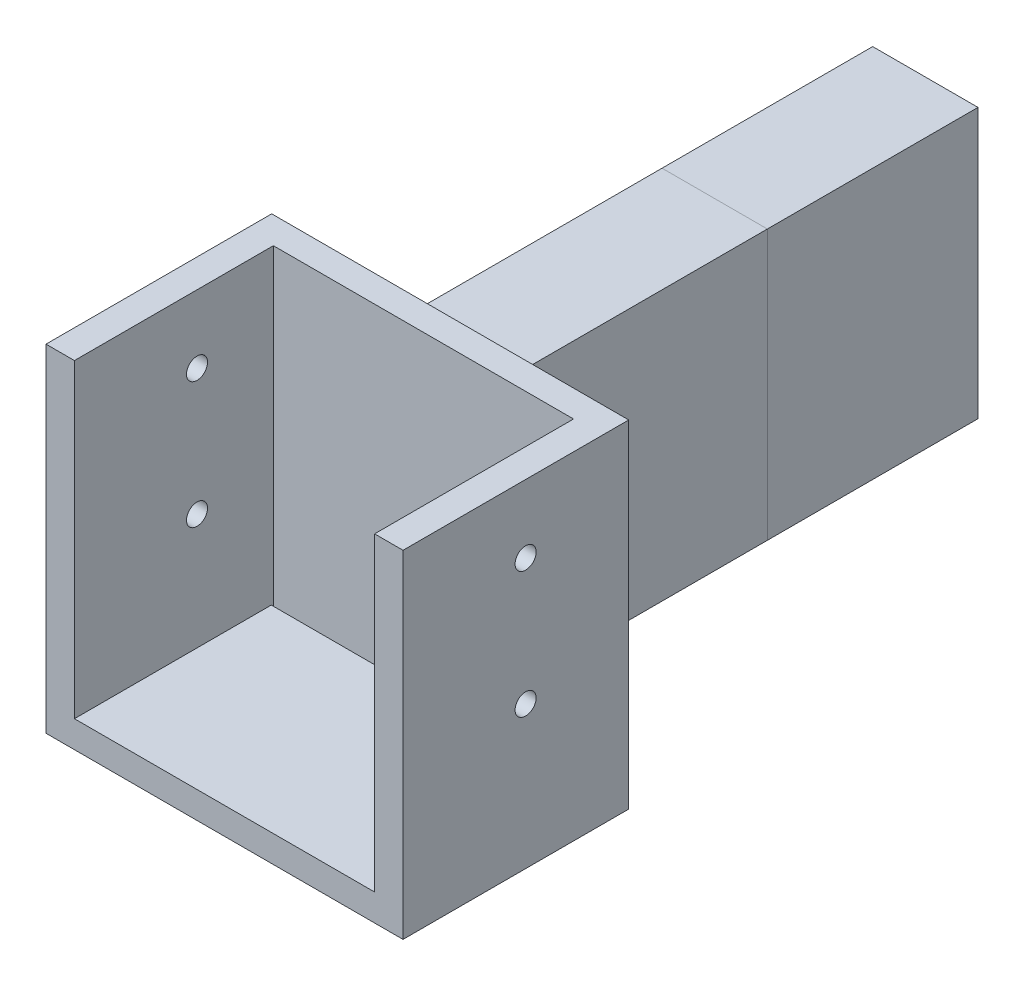
ISO-10303-21;
HEADER;
FILE_DESCRIPTION(('STEP AP214'),'2;1');
FILE_NAME('part.step','',(''),(''),'','','');
FILE_SCHEMA(('AUTOMOTIVE_DESIGN { 1 0 10303 214 1 1 1 1 }'));
ENDSEC;
DATA;
#1=APPLICATION_CONTEXT('core data for automotive mechanical design processes');
#2=APPLICATION_PROTOCOL_DEFINITION('international standard','automotive_design',2000,#1);
#3=PRODUCT_CONTEXT('',#1,'mechanical');
#4=PRODUCT('Part','Part','',(#3));
#5=PRODUCT_RELATED_PRODUCT_CATEGORY('part','',(#4));
#6=PRODUCT_DEFINITION_FORMATION('','',#4);
#7=PRODUCT_DEFINITION_CONTEXT('part definition',#1,'design');
#8=PRODUCT_DEFINITION('design','',#6,#7);
#9=PRODUCT_DEFINITION_SHAPE('','',#8);
#10=(LENGTH_UNIT() NAMED_UNIT(*) SI_UNIT(.MILLI.,.METRE.));
#11=(NAMED_UNIT(*) PLANE_ANGLE_UNIT() SI_UNIT($,.RADIAN.));
#12=(NAMED_UNIT(*) SI_UNIT($,.STERADIAN.) SOLID_ANGLE_UNIT());
#13=UNCERTAINTY_MEASURE_WITH_UNIT(LENGTH_MEASURE(1.E-05),#10,'distance_accuracy_value','');
#14=(GEOMETRIC_REPRESENTATION_CONTEXT(3) GLOBAL_UNCERTAINTY_ASSIGNED_CONTEXT((#13)) GLOBAL_UNIT_ASSIGNED_CONTEXT((#10,
#11,#12)) REPRESENTATION_CONTEXT('',''));
#15=CARTESIAN_POINT('',(0.,0.,0.));
#16=DIRECTION('',(0.,0.,1.));
#17=DIRECTION('',(1.,0.,0.));
#18=AXIS2_PLACEMENT_3D('',#15,#16,#17);
#19=CARTESIAN_POINT('',(-5.,28.6743328702386,-37.8156931180885));
#20=DIRECTION('',(0.,0.,-1.));
#21=DIRECTION('',(-1.,0.,0.));
#22=AXIS2_PLACEMENT_3D('',#19,#20,#21);
#23=PLANE('',#22);
#24=DIRECTION('',(1.,0.,0.));
#25=VECTOR('',#24,1.);
#26=CARTESIAN_POINT('',(-5.,3.07250683078621,-37.8156931180885));
#27=LINE('',#26,#25);
#28=CARTESIAN_POINT('',(-5.,3.07250683078621,-37.8156931180885));
#29=VERTEX_POINT('',#28);
#30=CARTESIAN_POINT('',(5.,3.07250683078621,-37.8156931180885));
#31=VERTEX_POINT('',#30);
#32=EDGE_CURVE('P0_E114',#29,#31,#27,.T.);
#33=ORIENTED_EDGE('',*,*,#32,.F.);
#34=DIRECTION('',(0.,1.,0.));
#35=VECTOR('',#34,1.);
#36=CARTESIAN_POINT('',(-5.,0.,-37.8156931180885));
#37=LINE('',#36,#35);
#38=CARTESIAN_POINT('',(-5.,28.6743328702386,-37.8156931180885));
#39=VERTEX_POINT('',#38);
#40=EDGE_CURVE('P0_E131',#39,#29,#37,.F.);
#41=ORIENTED_EDGE('',*,*,#40,.F.);
#42=DIRECTION('',(1.,0.,0.));
#43=VECTOR('',#42,1.);
#44=CARTESIAN_POINT('',(-5.,28.6743328702386,-37.8156931180885));
#45=LINE('',#44,#43);
#46=CARTESIAN_POINT('',(5.,28.6743328702386,-37.8156931180885));
#47=VERTEX_POINT('',#46);
#48=EDGE_CURVE('P0_E128',#47,#39,#45,.F.);
#49=ORIENTED_EDGE('',*,*,#48,.F.);
#50=DIRECTION('',(0.,1.,0.));
#51=VECTOR('',#50,1.);
#52=CARTESIAN_POINT('',(5.,0.,-37.8156931180885));
#53=LINE('',#52,#51);
#54=EDGE_CURVE('P0_E119',#47,#31,#53,.F.);
#55=ORIENTED_EDGE('',*,*,#54,.T.);
#56=EDGE_LOOP('',(#33,#41,#49,#55));
#57=FACE_BOUND('',#56,.T.);
#58=ADVANCED_FACE('P0_F17',(#57),#23,.T.);
#59=CARTESIAN_POINT('',(-5.,28.6743328702386,-12.2063953488372));
#60=DIRECTION('',(0.,1.,0.));
#61=DIRECTION('',(0.,0.,1.));
#62=AXIS2_PLACEMENT_3D('',#59,#60,#61);
#63=PLANE('',#62);
#64=ORIENTED_EDGE('',*,*,#48,.T.);
#65=DIRECTION('',(0.,0.,1.));
#66=VECTOR('',#65,1.);
#67=CARTESIAN_POINT('',(-5.,28.6743328702386,0.));
#68=LINE('',#67,#66);
#69=CARTESIAN_POINT('',(-5.,28.6743328702386,-12.2063953488372));
#70=VERTEX_POINT('',#69);
#71=EDGE_CURVE('P0_E190',#70,#39,#68,.F.);
#72=ORIENTED_EDGE('',*,*,#71,.F.);
#73=DIRECTION('',(1.,0.,0.));
#74=VECTOR('',#73,1.);
#75=CARTESIAN_POINT('',(-16.4529069767442,28.6743328702386,-12.2063953488372));
#76=LINE('',#75,#74);
#77=CARTESIAN_POINT('',(5.,28.6743328702386,-12.2063953488372));
#78=VERTEX_POINT('',#77);
#79=EDGE_CURVE('P0_E138',#70,#78,#76,.T.);
#80=ORIENTED_EDGE('',*,*,#79,.T.);
#81=DIRECTION('',(0.,0.,1.));
#82=VECTOR('',#81,1.);
#83=CARTESIAN_POINT('',(5.,28.6743328702386,0.));
#84=LINE('',#83,#82);
#85=EDGE_CURVE('P0_E124',#78,#47,#84,.F.);
#86=ORIENTED_EDGE('',*,*,#85,.T.);
#87=EDGE_LOOP('',(#64,#72,#80,#86));
#88=FACE_BOUND('',#87,.T.);
#89=ADVANCED_FACE('P0_F137',(#88),#63,.T.);
#90=CARTESIAN_POINT('',(5.,0.,0.));
#91=DIRECTION('',(-1.,0.,0.));
#92=DIRECTION('',(0.,0.,1.));
#93=AXIS2_PLACEMENT_3D('',#90,#91,#92);
#94=PLANE('',#93);
#95=DIRECTION('',(0.,1.,0.));
#96=VECTOR('',#95,1.);
#97=CARTESIAN_POINT('',(5.,32.,-12.2063953488372));
#98=LINE('',#97,#96);
#99=CARTESIAN_POINT('',(5.,3.07250683078621,-12.2063953488372));
#100=VERTEX_POINT('',#99);
#101=EDGE_CURVE('P0_E198',#78,#100,#98,.F.);
#102=ORIENTED_EDGE('',*,*,#101,.T.);
#103=DIRECTION('',(0.,0.,-1.));
#104=VECTOR('',#103,1.);
#105=CARTESIAN_POINT('',(5.,3.07250683078621,-12.2063953488372));
#106=LINE('',#105,#104);
#107=EDGE_CURVE('P0_E126',#31,#100,#106,.F.);
#108=ORIENTED_EDGE('',*,*,#107,.F.);
#109=ORIENTED_EDGE('',*,*,#54,.F.);
#110=ORIENTED_EDGE('',*,*,#85,.F.);
#111=EDGE_LOOP('',(#102,#108,#109,#110));
#112=FACE_BOUND('',#111,.T.);
#113=ADVANCED_FACE('P0_F122',(#112),#94,.F.);
#114=CARTESIAN_POINT('',(-5.,3.07250683078621,-12.2063953488372));
#115=DIRECTION('',(0.,-1.,0.));
#116=DIRECTION('',(0.,0.,-1.));
#117=AXIS2_PLACEMENT_3D('',#114,#115,#116);
#118=PLANE('',#117);
#119=DIRECTION('',(1.,0.,0.));
#120=VECTOR('',#119,1.);
#121=CARTESIAN_POINT('',(-16.4529069767442,3.07250683078621,-12.2063953488372));
#122=LINE('',#121,#120);
#123=CARTESIAN_POINT('',(-5.,3.07250683078621,-12.2063953488372));
#124=VERTEX_POINT('',#123);
#125=EDGE_CURVE('P0_E194',#100,#124,#122,.F.);
#126=ORIENTED_EDGE('',*,*,#125,.T.);
#127=DIRECTION('',(0.,0.,1.));
#128=VECTOR('',#127,1.);
#129=CARTESIAN_POINT('',(-5.,3.07250683078621,0.));
#130=LINE('',#129,#128);
#131=EDGE_CURVE('P0_E184',#29,#124,#130,.T.);
#132=ORIENTED_EDGE('',*,*,#131,.F.);
#133=ORIENTED_EDGE('',*,*,#32,.T.);
#134=ORIENTED_EDGE('',*,*,#107,.T.);
#135=EDGE_LOOP('',(#126,#132,#133,#134));
#136=FACE_BOUND('',#135,.T.);
#137=ADVANCED_FACE('P0_F193',(#136),#118,.T.);
#138=CARTESIAN_POINT('',(-5.,0.,0.));
#139=DIRECTION('',(-1.,0.,0.));
#140=DIRECTION('',(0.,0.,1.));
#141=AXIS2_PLACEMENT_3D('',#138,#139,#140);
#142=PLANE('',#141);
#143=ORIENTED_EDGE('',*,*,#131,.T.);
#144=DIRECTION('',(0.,1.,0.));
#145=VECTOR('',#144,1.);
#146=CARTESIAN_POINT('',(-5.,32.,-12.2063953488372));
#147=LINE('',#146,#145);
#148=EDGE_CURVE('P0_E200',#124,#70,#147,.T.);
#149=ORIENTED_EDGE('',*,*,#148,.T.);
#150=ORIENTED_EDGE('',*,*,#71,.T.);
#151=ORIENTED_EDGE('',*,*,#40,.T.);
#152=EDGE_LOOP('',(#143,#149,#150,#151));
#153=FACE_BOUND('',#152,.T.);
#154=ADVANCED_FACE('P0_F337',(#153),#142,.T.);
#155=CARTESIAN_POINT('',(17.4470930232558,25.5486727570291,-2.41569767441797));
#156=DIRECTION('',(-1.,0.,0.));
#157=DIRECTION('',(0.,0.,1.));
#158=AXIS2_PLACEMENT_3D('',#155,#156,#157);
#159=CYLINDRICAL_SURFACE('',#158,1.00000000000003);
#160=CARTESIAN_POINT('',(-13.7529069767442,25.5486727570291,-2.41569767441797));
#161=DIRECTION('',(-1.,0.,0.));
#162=DIRECTION('',(0.,0.,1.));
#163=AXIS2_PLACEMENT_3D('',#160,#161,#162);
#164=CIRCLE('',#163,1.00000000000003);
#165=CARTESIAN_POINT('',(-13.7529069767442,25.5486727570291,-1.41569767441794));
#166=VERTEX_POINT('',#165);
#167=EDGE_CURVE('P0_E155',#166,#166,#164,.F.);
#168=ORIENTED_EDGE('',*,*,#167,.T.);
#169=EDGE_LOOP('',(#168));
#170=FACE_BOUND('',#169,.T.);
#171=CARTESIAN_POINT('',(-16.4529069767442,25.5486727570291,-2.41569767441797));
#172=DIRECTION('',(-1.,0.,0.));
#173=DIRECTION('',(0.,0.,1.));
#174=AXIS2_PLACEMENT_3D('',#171,#172,#173);
#175=CIRCLE('',#174,1.00000000000003);
#176=CARTESIAN_POINT('',(-16.4529069767442,25.5486727570291,-1.41569767441794));
#177=VERTEX_POINT('',#176);
#178=EDGE_CURVE('P0_E20',#177,#177,#175,.T.);
#179=ORIENTED_EDGE('',*,*,#178,.T.);
#180=EDGE_LOOP('',(#179));
#181=FACE_BOUND('',#180,.T.);
#182=ADVANCED_FACE('P0_F333',(#170,#181),#159,.F.);
#183=CARTESIAN_POINT('',(17.4470930232558,13.5486727570291,-2.41569767441797));
#184=DIRECTION('',(-1.,0.,0.));
#185=DIRECTION('',(0.,0.,1.));
#186=AXIS2_PLACEMENT_3D('',#183,#184,#185);
#187=CYLINDRICAL_SURFACE('',#186,1.00000000000003);
#188=CARTESIAN_POINT('',(-13.7529069767442,13.5486727570291,-2.41569767441797));
#189=DIRECTION('',(-1.,0.,0.));
#190=DIRECTION('',(0.,0.,1.));
#191=AXIS2_PLACEMENT_3D('',#188,#189,#190);
#192=CIRCLE('',#191,1.00000000000003);
#193=CARTESIAN_POINT('',(-13.7529069767442,13.5486727570291,-1.41569767441794));
#194=VERTEX_POINT('',#193);
#195=EDGE_CURVE('P0_E151',#194,#194,#192,.F.);
#196=ORIENTED_EDGE('',*,*,#195,.T.);
#197=EDGE_LOOP('',(#196));
#198=FACE_BOUND('',#197,.T.);
#199=CARTESIAN_POINT('',(-16.4529069767442,13.5486727570291,-2.41569767441797));
#200=DIRECTION('',(-1.,0.,0.));
#201=DIRECTION('',(0.,0.,1.));
#202=AXIS2_PLACEMENT_3D('',#199,#200,#201);
#203=CIRCLE('',#202,1.00000000000003);
#204=CARTESIAN_POINT('',(-16.4529069767442,13.5486727570291,-1.41569767441794));
#205=VERTEX_POINT('',#204);
#206=EDGE_CURVE('P0_E166',#205,#205,#203,.T.);
#207=ORIENTED_EDGE('',*,*,#206,.T.);
#208=EDGE_LOOP('',(#207));
#209=FACE_BOUND('',#208,.T.);
#210=ADVANCED_FACE('P0_F329',(#198,#209),#187,.F.);
#211=CARTESIAN_POINT('',(17.4470930232558,25.5486727570291,-2.41569767441797));
#212=DIRECTION('',(-1.,0.,0.));
#213=DIRECTION('',(0.,0.,1.));
#214=AXIS2_PLACEMENT_3D('',#211,#212,#213);
#215=CYLINDRICAL_SURFACE('',#214,1.00000000000003);
#216=CARTESIAN_POINT('',(14.7470930232558,25.5486727570291,-2.41569767441797));
#217=DIRECTION('',(-1.,0.,0.));
#218=DIRECTION('',(0.,0.,1.));
#219=AXIS2_PLACEMENT_3D('',#216,#217,#218);
#220=CIRCLE('',#219,1.00000000000003);
#221=CARTESIAN_POINT('',(14.7470930232558,25.5486727570291,-1.41569767441794));
#222=VERTEX_POINT('',#221);
#223=EDGE_CURVE('P0_E147',#222,#222,#220,.T.);
#224=ORIENTED_EDGE('',*,*,#223,.T.);
#225=EDGE_LOOP('',(#224));
#226=FACE_BOUND('',#225,.T.);
#227=CARTESIAN_POINT('',(17.4470930232558,25.5486727570291,-2.41569767441797));
#228=DIRECTION('',(-1.,0.,0.));
#229=DIRECTION('',(0.,0.,1.));
#230=AXIS2_PLACEMENT_3D('',#227,#228,#229);
#231=CIRCLE('',#230,1.00000000000003);
#232=CARTESIAN_POINT('',(17.4470930232558,25.5486727570291,-1.41569767441794));
#233=VERTEX_POINT('',#232);
#234=EDGE_CURVE('P0_E163',#233,#233,#231,.F.);
#235=ORIENTED_EDGE('',*,*,#234,.T.);
#236=EDGE_LOOP('',(#235));
#237=FACE_BOUND('',#236,.T.);
#238=ADVANCED_FACE('P0_F325',(#226,#237),#215,.F.);
#239=CARTESIAN_POINT('',(17.4470930232558,13.5486727570291,-2.41569767441797));
#240=DIRECTION('',(-1.,0.,0.));
#241=DIRECTION('',(0.,0.,1.));
#242=AXIS2_PLACEMENT_3D('',#239,#240,#241);
#243=CYLINDRICAL_SURFACE('',#242,1.00000000000003);
#244=CARTESIAN_POINT('',(14.7470930232558,13.5486727570291,-2.41569767441797));
#245=DIRECTION('',(-1.,0.,0.));
#246=DIRECTION('',(0.,0.,1.));
#247=AXIS2_PLACEMENT_3D('',#244,#245,#246);
#248=CIRCLE('',#247,1.00000000000003);
#249=CARTESIAN_POINT('',(14.7470930232558,13.5486727570291,-1.41569767441794));
#250=VERTEX_POINT('',#249);
#251=EDGE_CURVE('P0_E143',#250,#250,#248,.T.);
#252=ORIENTED_EDGE('',*,*,#251,.T.);
#253=EDGE_LOOP('',(#252));
#254=FACE_BOUND('',#253,.T.);
#255=CARTESIAN_POINT('',(17.4470930232558,13.5486727570291,-2.41569767441797));
#256=DIRECTION('',(-1.,0.,0.));
#257=DIRECTION('',(0.,0.,1.));
#258=AXIS2_PLACEMENT_3D('',#255,#256,#257);
#259=CIRCLE('',#258,1.00000000000003);
#260=CARTESIAN_POINT('',(17.4470930232558,13.5486727570291,-1.41569767441794));
#261=VERTEX_POINT('',#260);
#262=EDGE_CURVE('P0_E159',#261,#261,#259,.F.);
#263=ORIENTED_EDGE('',*,*,#262,.T.);
#264=EDGE_LOOP('',(#263));
#265=FACE_BOUND('',#264,.T.);
#266=ADVANCED_FACE('P0_F322',(#254,#265),#243,.F.);
#267=CARTESIAN_POINT('',(33.6105596230915,2.54867275702964,9.22383720930233));
#268=DIRECTION('',(0.,-1.,0.));
#269=DIRECTION('',(0.,0.,-1.));
#270=AXIS2_PLACEMENT_3D('',#267,#268,#269);
#271=PLANE('',#270);
#272=DIRECTION('',(1.,0.,0.));
#273=VECTOR('',#272,1.);
#274=CARTESIAN_POINT('',(33.6105596230915,2.54867275702964,-9.46665875363806));
#275=LINE('',#274,#273);
#276=CARTESIAN_POINT('',(14.7470930232558,2.54867275702964,-9.46665875363806));
#277=VERTEX_POINT('',#276);
#278=CARTESIAN_POINT('',(-13.7529069767442,2.54867275702964,-9.46665875363806));
#279=VERTEX_POINT('',#278);
#280=EDGE_CURVE('P0_E177',#277,#279,#275,.F.);
#281=ORIENTED_EDGE('',*,*,#280,.T.);
#282=DIRECTION('',(0.,0.,1.));
#283=VECTOR('',#282,1.);
#284=CARTESIAN_POINT('',(-13.7529069767442,2.54867275702964,-9.6656976744186));
#285=LINE('',#284,#283);
#286=CARTESIAN_POINT('',(-13.7529069767442,2.54867275702964,9.22383720930233));
#287=VERTEX_POINT('',#286);
#288=EDGE_CURVE('P0_E154',#279,#287,#285,.T.);
#289=ORIENTED_EDGE('',*,*,#288,.T.);
#290=DIRECTION('',(-1.,0.,0.));
#291=VECTOR('',#290,1.);
#292=CARTESIAN_POINT('',(14.7470930232558,2.54867275702964,9.22383720930233));
#293=LINE('',#292,#291);
#294=CARTESIAN_POINT('',(14.7470930232558,2.54867275702964,9.22383720930233));
#295=VERTEX_POINT('',#294);
#296=EDGE_CURVE('P0_E174',#287,#295,#293,.F.);
#297=ORIENTED_EDGE('',*,*,#296,.T.);
#298=DIRECTION('',(0.,0.,-1.));
#299=VECTOR('',#298,1.);
#300=CARTESIAN_POINT('',(14.7470930232558,2.54867275702964,-9.6656976744186));
#301=LINE('',#300,#299);
#302=EDGE_CURVE('P0_E237',#295,#277,#301,.T.);
#303=ORIENTED_EDGE('',*,*,#302,.T.);
#304=EDGE_LOOP('',(#281,#289,#297,#303));
#305=FACE_BOUND('',#304,.T.);
#306=ADVANCED_FACE('P0_F318',(#305),#271,.F.);
#307=CARTESIAN_POINT('',(33.6105596230915,0.,-9.46665875363806));
#308=DIRECTION('',(0.,0.,1.));
#309=DIRECTION('',(1.,0.,0.));
#310=AXIS2_PLACEMENT_3D('',#307,#308,#309);
#311=PLANE('',#310);
#312=DIRECTION('',(1.,0.,0.));
#313=VECTOR('',#312,1.);
#314=CARTESIAN_POINT('',(0.,0.,-9.46665875363806));
#315=LINE('',#314,#313);
#316=CARTESIAN_POINT('',(-13.7529069767442,0.,-9.46665875363806));
#317=VERTEX_POINT('',#316);
#318=CARTESIAN_POINT('',(14.7470930232558,0.,-9.46665875363806));
#319=VERTEX_POINT('',#318);
#320=EDGE_CURVE('P0_E245',#317,#319,#315,.T.);
#321=ORIENTED_EDGE('',*,*,#320,.F.);
#322=DIRECTION('',(0.,1.,0.));
#323=VECTOR('',#322,1.);
#324=CARTESIAN_POINT('',(-13.7529069767442,32.,-9.46665875363806));
#325=LINE('',#324,#323);
#326=EDGE_CURVE('P0_E213',#317,#279,#325,.T.);
#327=ORIENTED_EDGE('',*,*,#326,.T.);
#328=ORIENTED_EDGE('',*,*,#280,.F.);
#329=DIRECTION('',(0.,1.,0.));
#330=VECTOR('',#329,1.);
#331=CARTESIAN_POINT('',(14.7470930232558,32.,-9.46665875363806));
#332=LINE('',#331,#330);
#333=EDGE_CURVE('P0_E239',#277,#319,#332,.F.);
#334=ORIENTED_EDGE('',*,*,#333,.T.);
#335=EDGE_LOOP('',(#321,#327,#328,#334));
#336=FACE_BOUND('',#335,.T.);
#337=ADVANCED_FACE('P0_F314',(#336),#311,.F.);
#338=CARTESIAN_POINT('',(14.7470930232558,32.,9.22383720930233));
#339=DIRECTION('',(0.,0.,-1.));
#340=DIRECTION('',(-1.,0.,0.));
#341=AXIS2_PLACEMENT_3D('',#338,#339,#340);
#342=PLANE('',#341);
#343=DIRECTION('',(0.,1.,0.));
#344=VECTOR('',#343,1.);
#345=CARTESIAN_POINT('',(17.4470930232558,32.,9.22383720930233));
#346=LINE('',#345,#344);
#347=CARTESIAN_POINT('',(17.4470930232558,0.,9.22383720930233));
#348=VERTEX_POINT('',#347);
#349=CARTESIAN_POINT('',(17.4470930232558,32.,9.22383720930233));
#350=VERTEX_POINT('',#349);
#351=EDGE_CURVE('P0_E162',#348,#350,#346,.T.);
#352=ORIENTED_EDGE('',*,*,#351,.T.);
#353=DIRECTION('',(1.,0.,0.));
#354=VECTOR('',#353,1.);
#355=CARTESIAN_POINT('',(0.,32.,9.22383720930233));
#356=LINE('',#355,#354);
#357=CARTESIAN_POINT('',(14.7470930232558,32.,9.22383720930233));
#358=VERTEX_POINT('',#357);
#359=EDGE_CURVE('P0_E225',#350,#358,#356,.F.);
#360=ORIENTED_EDGE('',*,*,#359,.T.);
#361=DIRECTION('',(0.,1.,0.));
#362=VECTOR('',#361,1.);
#363=CARTESIAN_POINT('',(14.7470930232558,32.,9.22383720930233));
#364=LINE('',#363,#362);
#365=EDGE_CURVE('P0_E234',#358,#295,#364,.F.);
#366=ORIENTED_EDGE('',*,*,#365,.T.);
#367=ORIENTED_EDGE('',*,*,#296,.F.);
#368=DIRECTION('',(0.,1.,0.));
#369=VECTOR('',#368,1.);
#370=CARTESIAN_POINT('',(-13.7529069767442,32.,9.22383720930233));
#371=LINE('',#370,#369);
#372=CARTESIAN_POINT('',(-13.7529069767442,32.,9.22383720930233));
#373=VERTEX_POINT('',#372);
#374=EDGE_CURVE('P0_E211',#287,#373,#371,.T.);
#375=ORIENTED_EDGE('',*,*,#374,.T.);
#376=DIRECTION('',(1.,0.,0.));
#377=VECTOR('',#376,1.);
#378=CARTESIAN_POINT('',(0.,32.,9.22383720930233));
#379=LINE('',#378,#377);
#380=CARTESIAN_POINT('',(-16.4529069767442,32.,9.22383720930233));
#381=VERTEX_POINT('',#380);
#382=EDGE_CURVE('P0_E150',#373,#381,#379,.F.);
#383=ORIENTED_EDGE('',*,*,#382,.T.);
#384=DIRECTION('',(0.,1.,0.));
#385=VECTOR('',#384,1.);
#386=CARTESIAN_POINT('',(-16.4529069767442,32.,9.22383720930233));
#387=LINE('',#386,#385);
#388=CARTESIAN_POINT('',(-16.4529069767442,0.,9.22383720930233));
#389=VERTEX_POINT('',#388);
#390=EDGE_CURVE('P0_E168',#381,#389,#387,.F.);
#391=ORIENTED_EDGE('',*,*,#390,.T.);
#392=DIRECTION('',(1.,0.,0.));
#393=VECTOR('',#392,1.);
#394=CARTESIAN_POINT('',(0.,0.,9.22383720930233));
#395=LINE('',#394,#393);
#396=EDGE_CURVE('P0_E248',#348,#389,#395,.F.);
#397=ORIENTED_EDGE('',*,*,#396,.F.);
#398=EDGE_LOOP('',(#352,#360,#366,#367,#375,#383,#391,#397));
#399=FACE_BOUND('',#398,.T.);
#400=ADVANCED_FACE('P0_F310',(#399),#342,.F.);
#401=CARTESIAN_POINT('',(-16.4529069767442,32.,-12.2063953488372));
#402=DIRECTION('',(1.,0.,0.));
#403=DIRECTION('',(0.,0.,-1.));
#404=AXIS2_PLACEMENT_3D('',#401,#402,#403);
#405=PLANE('',#404);
#406=ORIENTED_EDGE('',*,*,#390,.F.);
#407=DIRECTION('',(0.,0.,-1.));
#408=VECTOR('',#407,1.);
#409=CARTESIAN_POINT('',(-16.4529069767442,32.,0.));
#410=LINE('',#409,#408);
#411=CARTESIAN_POINT('',(-16.4529069767442,32.,-12.2063953488372));
#412=VERTEX_POINT('',#411);
#413=EDGE_CURVE('P0_E216',#381,#412,#410,.T.);
#414=ORIENTED_EDGE('',*,*,#413,.T.);
#415=DIRECTION('',(0.,1.,0.));
#416=VECTOR('',#415,1.);
#417=CARTESIAN_POINT('',(-16.4529069767442,32.,-12.2063953488372));
#418=LINE('',#417,#416);
#419=CARTESIAN_POINT('',(-16.4529069767442,0.,-12.2063953488372));
#420=VERTEX_POINT('',#419);
#421=EDGE_CURVE('P0_E165',#412,#420,#418,.F.);
#422=ORIENTED_EDGE('',*,*,#421,.T.);
#423=DIRECTION('',(0.,0.,-1.));
#424=VECTOR('',#423,1.);
#425=CARTESIAN_POINT('',(-16.4529069767442,0.,0.));
#426=LINE('',#425,#424);
#427=EDGE_CURVE('P0_E250',#389,#420,#426,.T.);
#428=ORIENTED_EDGE('',*,*,#427,.F.);
#429=EDGE_LOOP('',(#406,#414,#422,#428));
#430=FACE_BOUND('',#429,.T.);
#431=ORIENTED_EDGE('',*,*,#206,.F.);
#432=EDGE_LOOP('',(#431));
#433=FACE_BOUND('',#432,.T.);
#434=ORIENTED_EDGE('',*,*,#178,.F.);
#435=EDGE_LOOP('',(#434));
#436=FACE_BOUND('',#435,.T.);
#437=ADVANCED_FACE('P0_F306',(#430,#433,#436),#405,.F.);
#438=CARTESIAN_POINT('',(-16.4529069767442,32.,-12.2063953488372));
#439=DIRECTION('',(0.,0.,1.));
#440=DIRECTION('',(1.,0.,0.));
#441=AXIS2_PLACEMENT_3D('',#438,#439,#440);
#442=PLANE('',#441);
#443=ORIENTED_EDGE('',*,*,#421,.F.);
#444=DIRECTION('',(1.,0.,0.));
#445=VECTOR('',#444,1.);
#446=CARTESIAN_POINT('',(0.,32.,-12.2063953488372));
#447=LINE('',#446,#445);
#448=CARTESIAN_POINT('',(17.4470930232558,32.,-12.2063953488372));
#449=VERTEX_POINT('',#448);
#450=EDGE_CURVE('P0_E219',#412,#449,#447,.T.);
#451=ORIENTED_EDGE('',*,*,#450,.T.);
#452=DIRECTION('',(0.,1.,0.));
#453=VECTOR('',#452,1.);
#454=CARTESIAN_POINT('',(17.4470930232558,32.,-12.2063953488372));
#455=LINE('',#454,#453);
#456=CARTESIAN_POINT('',(17.4470930232558,0.,-12.2063953488372));
#457=VERTEX_POINT('',#456);
#458=EDGE_CURVE('P0_E158',#449,#457,#455,.F.);
#459=ORIENTED_EDGE('',*,*,#458,.T.);
#460=DIRECTION('',(1.,0.,0.));
#461=VECTOR('',#460,1.);
#462=CARTESIAN_POINT('',(0.,0.,-12.2063953488372));
#463=LINE('',#462,#461);
#464=EDGE_CURVE('P0_E252',#420,#457,#463,.T.);
#465=ORIENTED_EDGE('',*,*,#464,.F.);
#466=EDGE_LOOP('',(#443,#451,#459,#465));
#467=FACE_BOUND('',#466,.T.);
#468=ORIENTED_EDGE('',*,*,#125,.F.);
#469=ORIENTED_EDGE('',*,*,#101,.F.);
#470=ORIENTED_EDGE('',*,*,#79,.F.);
#471=ORIENTED_EDGE('',*,*,#148,.F.);
#472=EDGE_LOOP('',(#468,#469,#470,#471));
#473=FACE_BOUND('',#472,.T.);
#474=ADVANCED_FACE('P0_F197',(#467,#473),#442,.F.);
#475=CARTESIAN_POINT('',(17.4470930232558,32.,-12.2063953488372));
#476=DIRECTION('',(-1.,0.,0.));
#477=DIRECTION('',(0.,0.,1.));
#478=AXIS2_PLACEMENT_3D('',#475,#476,#477);
#479=PLANE('',#478);
#480=ORIENTED_EDGE('',*,*,#458,.F.);
#481=DIRECTION('',(0.,0.,-1.));
#482=VECTOR('',#481,1.);
#483=CARTESIAN_POINT('',(17.4470930232558,32.,0.));
#484=LINE('',#483,#482);
#485=EDGE_CURVE('P0_E222',#449,#350,#484,.F.);
#486=ORIENTED_EDGE('',*,*,#485,.T.);
#487=ORIENTED_EDGE('',*,*,#351,.F.);
#488=DIRECTION('',(0.,0.,-1.));
#489=VECTOR('',#488,1.);
#490=CARTESIAN_POINT('',(17.4470930232558,0.,0.));
#491=LINE('',#490,#489);
#492=EDGE_CURVE('P0_E254',#457,#348,#491,.F.);
#493=ORIENTED_EDGE('',*,*,#492,.F.);
#494=EDGE_LOOP('',(#480,#486,#487,#493));
#495=FACE_BOUND('',#494,.T.);
#496=ORIENTED_EDGE('',*,*,#262,.F.);
#497=EDGE_LOOP('',(#496));
#498=FACE_BOUND('',#497,.T.);
#499=ORIENTED_EDGE('',*,*,#234,.F.);
#500=EDGE_LOOP('',(#499));
#501=FACE_BOUND('',#500,.T.);
#502=ADVANCED_FACE('P0_F300',(#495,#498,#501),#479,.F.);
#503=CARTESIAN_POINT('',(-13.7529069767442,32.,-9.6656976744186));
#504=DIRECTION('',(-1.,0.,0.));
#505=DIRECTION('',(0.,0.,1.));
#506=AXIS2_PLACEMENT_3D('',#503,#504,#505);
#507=PLANE('',#506);
#508=DIRECTION('',(0.,0.,-1.));
#509=VECTOR('',#508,1.);
#510=CARTESIAN_POINT('',(-13.7529069767442,0.,0.));
#511=LINE('',#510,#509);
#512=CARTESIAN_POINT('',(-13.7529069767442,0.,-9.6656976744186));
#513=VERTEX_POINT('',#512);
#514=EDGE_CURVE('P0_E242',#513,#317,#511,.F.);
#515=ORIENTED_EDGE('',*,*,#514,.F.);
#516=DIRECTION('',(0.,1.,0.));
#517=VECTOR('',#516,1.);
#518=CARTESIAN_POINT('',(-13.7529069767442,32.,-9.6656976744186));
#519=LINE('',#518,#517);
#520=CARTESIAN_POINT('',(-13.7529069767442,32.,-9.6656976744186));
#521=VERTEX_POINT('',#520);
#522=EDGE_CURVE('P0_E257',#513,#521,#519,.T.);
#523=ORIENTED_EDGE('',*,*,#522,.T.);
#524=DIRECTION('',(0.,0.,-1.));
#525=VECTOR('',#524,1.);
#526=CARTESIAN_POINT('',(-13.7529069767442,32.,0.));
#527=LINE('',#526,#525);
#528=EDGE_CURVE('P0_E227',#521,#373,#527,.F.);
#529=ORIENTED_EDGE('',*,*,#528,.T.);
#530=ORIENTED_EDGE('',*,*,#374,.F.);
#531=ORIENTED_EDGE('',*,*,#288,.F.);
#532=ORIENTED_EDGE('',*,*,#326,.F.);
#533=EDGE_LOOP('',(#515,#523,#529,#530,#531,#532));
#534=FACE_BOUND('',#533,.T.);
#535=ORIENTED_EDGE('',*,*,#195,.F.);
#536=EDGE_LOOP('',(#535));
#537=FACE_BOUND('',#536,.T.);
#538=ORIENTED_EDGE('',*,*,#167,.F.);
#539=EDGE_LOOP('',(#538));
#540=FACE_BOUND('',#539,.T.);
#541=ADVANCED_FACE('P0_F281',(#534,#537,#540),#507,.F.);
#542=CARTESIAN_POINT('',(0.,32.,0.));
#543=DIRECTION('',(0.,-1.,0.));
#544=DIRECTION('',(0.,0.,-1.));
#545=AXIS2_PLACEMENT_3D('',#542,#543,#544);
#546=PLANE('',#545);
#547=ORIENTED_EDGE('',*,*,#528,.F.);
#548=DIRECTION('',(-1.,0.,0.));
#549=VECTOR('',#548,1.);
#550=CARTESIAN_POINT('',(-13.7529069767442,32.,-9.6656976744186));
#551=LINE('',#550,#549);
#552=CARTESIAN_POINT('',(14.7470930232558,32.,-9.6656976744186));
#553=VERTEX_POINT('',#552);
#554=EDGE_CURVE('P0_E260',#521,#553,#551,.F.);
#555=ORIENTED_EDGE('',*,*,#554,.T.);
#556=DIRECTION('',(0.,0.,-1.));
#557=VECTOR('',#556,1.);
#558=CARTESIAN_POINT('',(14.7470930232558,32.,-9.6656976744186));
#559=LINE('',#558,#557);
#560=EDGE_CURVE('P0_E146',#553,#358,#559,.F.);
#561=ORIENTED_EDGE('',*,*,#560,.T.);
#562=ORIENTED_EDGE('',*,*,#359,.F.);
#563=ORIENTED_EDGE('',*,*,#485,.F.);
#564=ORIENTED_EDGE('',*,*,#450,.F.);
#565=ORIENTED_EDGE('',*,*,#413,.F.);
#566=ORIENTED_EDGE('',*,*,#382,.F.);
#567=EDGE_LOOP('',(#547,#555,#561,#562,#563,#564,#565,#566));
#568=FACE_BOUND('',#567,.T.);
#569=ADVANCED_FACE('P0_F274',(#568),#546,.F.);
#570=CARTESIAN_POINT('',(14.7470930232558,32.,-9.6656976744186));
#571=DIRECTION('',(1.,0.,0.));
#572=DIRECTION('',(0.,0.,-1.));
#573=AXIS2_PLACEMENT_3D('',#570,#571,#572);
#574=PLANE('',#573);
#575=ORIENTED_EDGE('',*,*,#302,.F.);
#576=ORIENTED_EDGE('',*,*,#365,.F.);
#577=ORIENTED_EDGE('',*,*,#560,.F.);
#578=DIRECTION('',(0.,1.,0.));
#579=VECTOR('',#578,1.);
#580=CARTESIAN_POINT('',(14.7470930232558,32.,-9.6656976744186));
#581=LINE('',#580,#579);
#582=CARTESIAN_POINT('',(14.7470930232558,0.,-9.6656976744186));
#583=VERTEX_POINT('',#582);
#584=EDGE_CURVE('P0_E26',#553,#583,#581,.F.);
#585=ORIENTED_EDGE('',*,*,#584,.T.);
#586=DIRECTION('',(0.,0.,-1.));
#587=VECTOR('',#586,1.);
#588=CARTESIAN_POINT('',(14.7470930232558,0.,0.));
#589=LINE('',#588,#587);
#590=EDGE_CURVE('P0_E34',#319,#583,#589,.T.);
#591=ORIENTED_EDGE('',*,*,#590,.F.);
#592=ORIENTED_EDGE('',*,*,#333,.F.);
#593=EDGE_LOOP('',(#575,#576,#577,#585,#591,#592));
#594=FACE_BOUND('',#593,.T.);
#595=ORIENTED_EDGE('',*,*,#251,.F.);
#596=EDGE_LOOP('',(#595));
#597=FACE_BOUND('',#596,.T.);
#598=ORIENTED_EDGE('',*,*,#223,.F.);
#599=EDGE_LOOP('',(#598));
#600=FACE_BOUND('',#599,.T.);
#601=ADVANCED_FACE('P0_F266',(#594,#597,#600),#574,.F.);
#602=CARTESIAN_POINT('',(0.,0.,0.));
#603=DIRECTION('',(0.,-1.,0.));
#604=DIRECTION('',(0.,0.,-1.));
#605=AXIS2_PLACEMENT_3D('',#602,#603,#604);
#606=PLANE('',#605);
#607=ORIENTED_EDGE('',*,*,#464,.T.);
#608=ORIENTED_EDGE('',*,*,#492,.T.);
#609=ORIENTED_EDGE('',*,*,#396,.T.);
#610=ORIENTED_EDGE('',*,*,#427,.T.);
#611=EDGE_LOOP('',(#607,#608,#609,#610));
#612=FACE_BOUND('',#611,.T.);
#613=ORIENTED_EDGE('',*,*,#590,.T.);
#614=DIRECTION('',(-1.,0.,0.));
#615=VECTOR('',#614,1.);
#616=CARTESIAN_POINT('',(-13.7529069767442,0.,-9.6656976744186));
#617=LINE('',#616,#615);
#618=EDGE_CURVE('P0_E11',#583,#513,#617,.T.);
#619=ORIENTED_EDGE('',*,*,#618,.T.);
#620=ORIENTED_EDGE('',*,*,#514,.T.);
#621=ORIENTED_EDGE('',*,*,#320,.T.);
#622=EDGE_LOOP('',(#613,#619,#620,#621));
#623=FACE_BOUND('',#622,.T.);
#624=ADVANCED_FACE('P0_F284',(#612,#623),#606,.T.);
#625=CARTESIAN_POINT('',(-13.7529069767442,32.,-9.6656976744186));
#626=DIRECTION('',(0.,0.,-1.));
#627=DIRECTION('',(-1.,0.,0.));
#628=AXIS2_PLACEMENT_3D('',#625,#626,#627);
#629=PLANE('',#628);
#630=ORIENTED_EDGE('',*,*,#584,.F.);
#631=ORIENTED_EDGE('',*,*,#554,.F.);
#632=ORIENTED_EDGE('',*,*,#522,.F.);
#633=ORIENTED_EDGE('',*,*,#618,.F.);
#634=EDGE_LOOP('',(#630,#631,#632,#633));
#635=FACE_BOUND('',#634,.T.);
#636=ADVANCED_FACE('P0_F272',(#635),#629,.F.);
#637=CLOSED_SHELL('',(#58,#89,#113,#137,#154,#182,#210,#238,#266,#306,#337,#400,#437,#474,#502,
#541,#569,#601,#624,#636));
#638=MANIFOLD_SOLID_BREP('P0_B1',#637);
#639=CARTESIAN_POINT('',(5.,28.6743328702386,-57.8156931180885));
#640=DIRECTION('',(-1.,0.,0.));
#641=DIRECTION('',(0.,0.,1.));
#642=AXIS2_PLACEMENT_3D('',#639,#640,#641);
#643=PLANE('',#642);
#644=DIRECTION('',(0.,0.,1.));
#645=VECTOR('',#644,1.);
#646=CARTESIAN_POINT('',(5.,3.07250683078621,-57.8156931180885));
#647=LINE('',#646,#645);
#648=CARTESIAN_POINT('',(5.,3.07250683078621,-37.8156931180885));
#649=VERTEX_POINT('',#648);
#650=CARTESIAN_POINT('',(5.,3.07250683078621,-57.8156931180885));
#651=VERTEX_POINT('',#650);
#652=EDGE_CURVE('P1_E20',#649,#651,#647,.F.);
#653=ORIENTED_EDGE('',*,*,#652,.T.);
#654=DIRECTION('',(0.,1.,0.));
#655=VECTOR('',#654,1.);
#656=CARTESIAN_POINT('',(5.,0.,-57.8156931180885));
#657=LINE('',#656,#655);
#658=CARTESIAN_POINT('',(5.,28.6743328702386,-57.8156931180885));
#659=VERTEX_POINT('',#658);
#660=EDGE_CURVE('P1_E55',#659,#651,#657,.F.);
#661=ORIENTED_EDGE('',*,*,#660,.F.);
#662=DIRECTION('',(0.,0.,-1.));
#663=VECTOR('',#662,1.);
#664=CARTESIAN_POINT('',(5.,28.6743328702386,-57.8156931180885));
#665=LINE('',#664,#663);
#666=CARTESIAN_POINT('',(5.,28.6743328702386,-37.8156931180885));
#667=VERTEX_POINT('',#666);
#668=EDGE_CURVE('P1_E74',#659,#667,#665,.F.);
#669=ORIENTED_EDGE('',*,*,#668,.T.);
#670=DIRECTION('',(0.,1.,0.));
#671=VECTOR('',#670,1.);
#672=CARTESIAN_POINT('',(5.,0.,-37.8156931180885));
#673=LINE('',#672,#671);
#674=EDGE_CURVE('P1_E66',#667,#649,#673,.F.);
#675=ORIENTED_EDGE('',*,*,#674,.T.);
#676=EDGE_LOOP('',(#653,#661,#669,#675));
#677=FACE_BOUND('',#676,.T.);
#678=ADVANCED_FACE('P1_F17',(#677),#643,.F.);
#679=CARTESIAN_POINT('',(5.,3.07250683078621,-57.8156931180885));
#680=DIRECTION('',(0.,1.,0.));
#681=DIRECTION('',(0.,0.,1.));
#682=AXIS2_PLACEMENT_3D('',#679,#680,#681);
#683=PLANE('',#682);
#684=DIRECTION('',(0.,0.,-1.));
#685=VECTOR('',#684,1.);
#686=CARTESIAN_POINT('',(-5.,3.07250683078621,-57.8156931180885));
#687=LINE('',#686,#685);
#688=CARTESIAN_POINT('',(-5.,3.07250683078621,-37.8156931180885));
#689=VERTEX_POINT('',#688);
#690=CARTESIAN_POINT('',(-5.,3.07250683078621,-57.8156931180885));
#691=VERTEX_POINT('',#690);
#692=EDGE_CURVE('P1_E72',#689,#691,#687,.T.);
#693=ORIENTED_EDGE('',*,*,#692,.T.);
#694=DIRECTION('',(-1.,0.,0.));
#695=VECTOR('',#694,1.);
#696=CARTESIAN_POINT('',(0.,3.07250683078621,-57.8156931180885));
#697=LINE('',#696,#695);
#698=EDGE_CURVE('P1_E62',#651,#691,#697,.T.);
#699=ORIENTED_EDGE('',*,*,#698,.F.);
#700=ORIENTED_EDGE('',*,*,#652,.F.);
#701=DIRECTION('',(-1.,0.,0.));
#702=VECTOR('',#701,1.);
#703=CARTESIAN_POINT('',(0.,3.07250683078621,-37.8156931180885));
#704=LINE('',#703,#702);
#705=EDGE_CURVE('P1_E80',#649,#689,#704,.T.);
#706=ORIENTED_EDGE('',*,*,#705,.T.);
#707=EDGE_LOOP('',(#693,#699,#700,#706));
#708=FACE_BOUND('',#707,.T.);
#709=ADVANCED_FACE('P1_F71',(#708),#683,.F.);
#710=CARTESIAN_POINT('',(0.,0.,-57.8156931180885));
#711=DIRECTION('',(0.,0.,-1.));
#712=DIRECTION('',(-1.,0.,0.));
#713=AXIS2_PLACEMENT_3D('',#710,#711,#712);
#714=PLANE('',#713);
#715=ORIENTED_EDGE('',*,*,#660,.T.);
#716=ORIENTED_EDGE('',*,*,#698,.T.);
#717=DIRECTION('',(0.,1.,0.));
#718=VECTOR('',#717,1.);
#719=CARTESIAN_POINT('',(-5.,3.07250683078621,-57.8156931180885));
#720=LINE('',#719,#718);
#721=CARTESIAN_POINT('',(-5.,28.6743328702386,-57.8156931180885));
#722=VERTEX_POINT('',#721);
#723=EDGE_CURVE('P1_E83',#691,#722,#720,.T.);
#724=ORIENTED_EDGE('',*,*,#723,.T.);
#725=DIRECTION('',(1.,0.,0.));
#726=VECTOR('',#725,1.);
#727=CARTESIAN_POINT('',(-5.,28.6743328702386,-57.8156931180885));
#728=LINE('',#727,#726);
#729=EDGE_CURVE('P1_E64',#722,#659,#728,.T.);
#730=ORIENTED_EDGE('',*,*,#729,.T.);
#731=EDGE_LOOP('',(#715,#716,#724,#730));
#732=FACE_BOUND('',#731,.T.);
#733=ADVANCED_FACE('P1_F59',(#732),#714,.T.);
#734=CARTESIAN_POINT('',(-5.,28.6743328702386,-57.8156931180885));
#735=DIRECTION('',(0.,-1.,0.));
#736=DIRECTION('',(0.,0.,-1.));
#737=AXIS2_PLACEMENT_3D('',#734,#735,#736);
#738=PLANE('',#737);
#739=ORIENTED_EDGE('',*,*,#668,.F.);
#740=ORIENTED_EDGE('',*,*,#729,.F.);
#741=DIRECTION('',(0.,0.,-1.));
#742=VECTOR('',#741,1.);
#743=CARTESIAN_POINT('',(-5.,28.6743328702386,-57.8156931180885));
#744=LINE('',#743,#742);
#745=CARTESIAN_POINT('',(-5.,28.6743328702386,-37.8156931180885));
#746=VERTEX_POINT('',#745);
#747=EDGE_CURVE('P1_E26',#722,#746,#744,.F.);
#748=ORIENTED_EDGE('',*,*,#747,.T.);
#749=DIRECTION('',(-1.,0.,0.));
#750=VECTOR('',#749,1.);
#751=CARTESIAN_POINT('',(0.,28.6743328702386,-37.8156931180885));
#752=LINE('',#751,#750);
#753=EDGE_CURVE('P1_E34',#746,#667,#752,.F.);
#754=ORIENTED_EDGE('',*,*,#753,.T.);
#755=EDGE_LOOP('',(#739,#740,#748,#754));
#756=FACE_BOUND('',#755,.T.);
#757=ADVANCED_FACE('P1_F88',(#756),#738,.F.);
#758=CARTESIAN_POINT('',(0.,0.,-37.8156931180885));
#759=DIRECTION('',(0.,0.,-1.));
#760=DIRECTION('',(-1.,0.,0.));
#761=AXIS2_PLACEMENT_3D('',#758,#759,#760);
#762=PLANE('',#761);
#763=ORIENTED_EDGE('',*,*,#705,.F.);
#764=ORIENTED_EDGE('',*,*,#674,.F.);
#765=ORIENTED_EDGE('',*,*,#753,.F.);
#766=DIRECTION('',(0.,1.,0.));
#767=VECTOR('',#766,1.);
#768=CARTESIAN_POINT('',(-5.,3.07250683078621,-37.8156931180885));
#769=LINE('',#768,#767);
#770=EDGE_CURVE('P1_E11',#746,#689,#769,.F.);
#771=ORIENTED_EDGE('',*,*,#770,.T.);
#772=EDGE_LOOP('',(#763,#764,#765,#771));
#773=FACE_BOUND('',#772,.T.);
#774=ADVANCED_FACE('P1_F91',(#773),#762,.F.);
#775=CARTESIAN_POINT('',(-5.,3.07250683078621,-57.8156931180885));
#776=DIRECTION('',(1.,0.,0.));
#777=DIRECTION('',(0.,0.,-1.));
#778=AXIS2_PLACEMENT_3D('',#775,#776,#777);
#779=PLANE('',#778);
#780=ORIENTED_EDGE('',*,*,#747,.F.);
#781=ORIENTED_EDGE('',*,*,#723,.F.);
#782=ORIENTED_EDGE('',*,*,#692,.F.);
#783=ORIENTED_EDGE('',*,*,#770,.F.);
#784=EDGE_LOOP('',(#780,#781,#782,#783));
#785=FACE_BOUND('',#784,.T.);
#786=ADVANCED_FACE('P1_F90',(#785),#779,.F.);
#787=CLOSED_SHELL('',(#678,#709,#733,#757,#774,#786));
#788=MANIFOLD_SOLID_BREP('P1_B1',#787);
#789=ADVANCED_BREP_SHAPE_REPRESENTATION('',(#18,#638,#788),#14);
#790=SHAPE_DEFINITION_REPRESENTATION(#9,#789);
ENDSEC;
END-ISO-10303-21;
